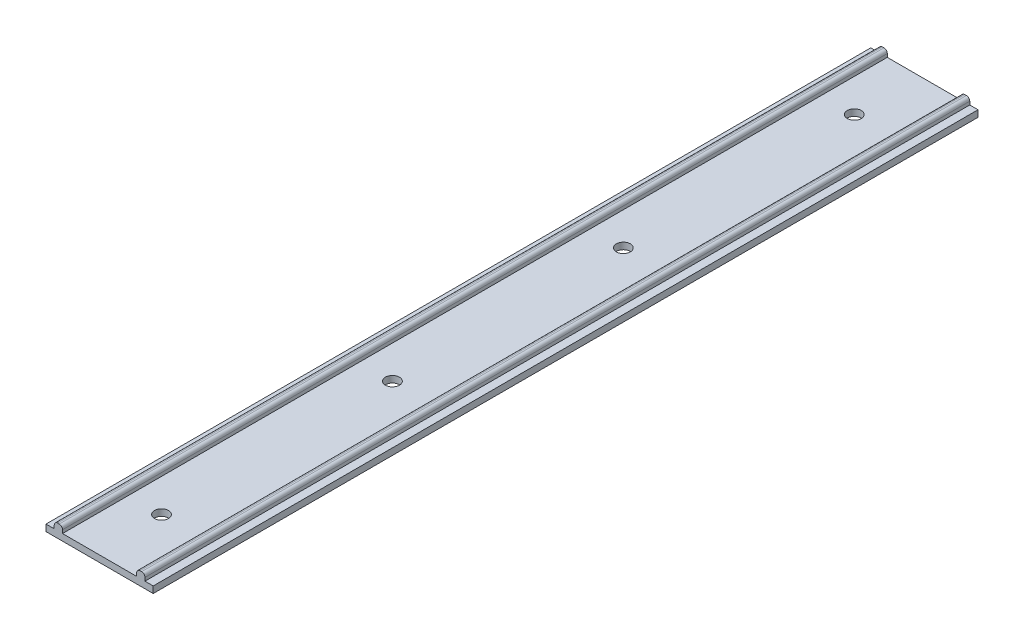
ISO-10303-21;
HEADER;
FILE_DESCRIPTION(('STEP AP214'),'2;1');
FILE_NAME('part.step','',(''),(''),'','','');
FILE_SCHEMA(('AUTOMOTIVE_DESIGN { 1 0 10303 214 1 1 1 1 }'));
ENDSEC;
DATA;
#1=APPLICATION_CONTEXT('core data for automotive mechanical design processes');
#2=APPLICATION_PROTOCOL_DEFINITION('international standard','automotive_design',2000,#1);
#3=PRODUCT_CONTEXT('',#1,'mechanical');
#4=PRODUCT('Part','Part','',(#3));
#5=PRODUCT_RELATED_PRODUCT_CATEGORY('part','',(#4));
#6=PRODUCT_DEFINITION_FORMATION('','',#4);
#7=PRODUCT_DEFINITION_CONTEXT('part definition',#1,'design');
#8=PRODUCT_DEFINITION('design','',#6,#7);
#9=PRODUCT_DEFINITION_SHAPE('','',#8);
#10=(LENGTH_UNIT() NAMED_UNIT(*) SI_UNIT(.MILLI.,.METRE.));
#11=(NAMED_UNIT(*) PLANE_ANGLE_UNIT() SI_UNIT($,.RADIAN.));
#12=(NAMED_UNIT(*) SI_UNIT($,.STERADIAN.) SOLID_ANGLE_UNIT());
#13=UNCERTAINTY_MEASURE_WITH_UNIT(LENGTH_MEASURE(1.E-05),#10,'distance_accuracy_value','');
#14=(GEOMETRIC_REPRESENTATION_CONTEXT(3) GLOBAL_UNCERTAINTY_ASSIGNED_CONTEXT((#13)) GLOBAL_UNIT_ASSIGNED_CONTEXT((#10,
#11,#12)) REPRESENTATION_CONTEXT('',''));
#15=CARTESIAN_POINT('',(0.,0.,0.));
#16=DIRECTION('',(0.,0.,1.));
#17=DIRECTION('',(1.,0.,0.));
#18=AXIS2_PLACEMENT_3D('',#15,#16,#17);
#19=CARTESIAN_POINT('',(0.,0.,-500.));
#20=DIRECTION('',(-1.,0.,0.));
#21=DIRECTION('',(0.,0.,1.));
#22=AXIS2_PLACEMENT_3D('',#19,#20,#21);
#23=PLANE('',#22);
#24=DIRECTION('',(0.,-1.,0.));
#25=VECTOR('',#24,1.);
#26=CARTESIAN_POINT('',(0.,0.,0.));
#27=LINE('',#26,#25);
#28=CARTESIAN_POINT('',(0.,4.,0.));
#29=VERTEX_POINT('',#28);
#30=CARTESIAN_POINT('',(0.,0.,0.));
#31=VERTEX_POINT('',#30);
#32=EDGE_CURVE('E208',#29,#31,#27,.T.);
#33=ORIENTED_EDGE('',*,*,#32,.F.);
#34=DIRECTION('',(0.,0.,1.));
#35=VECTOR('',#34,1.);
#36=CARTESIAN_POINT('',(0.,4.,-500.));
#37=LINE('',#36,#35);
#38=CARTESIAN_POINT('',(0.,4.,-500.));
#39=VERTEX_POINT('',#38);
#40=EDGE_CURVE('E175',#39,#29,#37,.T.);
#41=ORIENTED_EDGE('',*,*,#40,.F.);
#42=DIRECTION('',(0.,-1.,0.));
#43=VECTOR('',#42,1.);
#44=CARTESIAN_POINT('',(0.,0.,-500.));
#45=LINE('',#44,#43);
#46=CARTESIAN_POINT('',(0.,0.,-500.));
#47=VERTEX_POINT('',#46);
#48=EDGE_CURVE('E169',#39,#47,#45,.T.);
#49=ORIENTED_EDGE('',*,*,#48,.T.);
#50=DIRECTION('',(0.,0.,1.));
#51=VECTOR('',#50,1.);
#52=CARTESIAN_POINT('',(0.,0.,-500.));
#53=LINE('',#52,#51);
#54=EDGE_CURVE('E151',#47,#31,#53,.T.);
#55=ORIENTED_EDGE('',*,*,#54,.T.);
#56=EDGE_LOOP('',(#33,#41,#49,#55));
#57=FACE_BOUND('',#56,.T.);
#58=ADVANCED_FACE('F36',(#57),#23,.T.);
#59=CARTESIAN_POINT('',(0.,4.,-500.));
#60=DIRECTION('',(0.,1.,0.));
#61=DIRECTION('',(0.,0.,1.));
#62=AXIS2_PLACEMENT_3D('',#59,#60,#61);
#63=PLANE('',#62);
#64=DIRECTION('',(-1.,0.,0.));
#65=VECTOR('',#64,1.);
#66=CARTESIAN_POINT('',(0.,4.,0.));
#67=LINE('',#66,#65);
#68=CARTESIAN_POINT('',(5.,4.,0.));
#69=VERTEX_POINT('',#68);
#70=EDGE_CURVE('E176',#69,#29,#67,.T.);
#71=ORIENTED_EDGE('',*,*,#70,.F.);
#72=DIRECTION('',(0.,0.,1.));
#73=VECTOR('',#72,1.);
#74=CARTESIAN_POINT('',(5.,4.,-500.));
#75=LINE('',#74,#73);
#76=CARTESIAN_POINT('',(5.,4.,-500.));
#77=VERTEX_POINT('',#76);
#78=EDGE_CURVE('E237',#77,#69,#75,.T.);
#79=ORIENTED_EDGE('',*,*,#78,.F.);
#80=DIRECTION('',(-1.,0.,0.));
#81=VECTOR('',#80,1.);
#82=CARTESIAN_POINT('',(0.,4.,-500.));
#83=LINE('',#82,#81);
#84=EDGE_CURVE('E162',#77,#39,#83,.T.);
#85=ORIENTED_EDGE('',*,*,#84,.T.);
#86=ORIENTED_EDGE('',*,*,#40,.T.);
#87=EDGE_LOOP('',(#71,#79,#85,#86));
#88=FACE_BOUND('',#87,.T.);
#89=ADVANCED_FACE('F324',(#88),#63,.T.);
#90=CARTESIAN_POINT('',(5.,4.,-500.));
#91=DIRECTION('',(-1.,0.,0.));
#92=DIRECTION('',(0.,0.,1.));
#93=AXIS2_PLACEMENT_3D('',#90,#91,#92);
#94=PLANE('',#93);
#95=DIRECTION('',(0.,-1.,0.));
#96=VECTOR('',#95,1.);
#97=CARTESIAN_POINT('',(5.,4.,0.));
#98=LINE('',#97,#96);
#99=CARTESIAN_POINT('',(5.,6.,0.));
#100=VERTEX_POINT('',#99);
#101=EDGE_CURVE('E179',#100,#69,#98,.T.);
#102=ORIENTED_EDGE('',*,*,#101,.F.);
#103=DIRECTION('',(0.,0.,1.));
#104=VECTOR('',#103,1.);
#105=CARTESIAN_POINT('',(5.,6.,-500.));
#106=LINE('',#105,#104);
#107=CARTESIAN_POINT('',(5.,6.,-500.));
#108=VERTEX_POINT('',#107);
#109=EDGE_CURVE('E11',#100,#108,#106,.F.);
#110=ORIENTED_EDGE('',*,*,#109,.T.);
#111=DIRECTION('',(0.,-1.,0.));
#112=VECTOR('',#111,1.);
#113=CARTESIAN_POINT('',(5.,4.,-500.));
#114=LINE('',#113,#112);
#115=EDGE_CURVE('E205',#108,#77,#114,.T.);
#116=ORIENTED_EDGE('',*,*,#115,.T.);
#117=ORIENTED_EDGE('',*,*,#78,.T.);
#118=EDGE_LOOP('',(#102,#110,#116,#117));
#119=FACE_BOUND('',#118,.T.);
#120=ADVANCED_FACE('F328',(#119),#94,.T.);
#121=CARTESIAN_POINT('',(5.,8.,-500.));
#122=DIRECTION('',(0.,1.,0.));
#123=DIRECTION('',(-1.,0.,0.));
#124=AXIS2_PLACEMENT_3D('',#121,#122,#123);
#125=PLANE('',#124);
#126=DIRECTION('',(-1.,0.,0.));
#127=VECTOR('',#126,1.);
#128=CARTESIAN_POINT('',(5.,8.,0.));
#129=LINE('',#128,#127);
#130=CARTESIAN_POINT('',(8.00000000000001,8.,0.));
#131=VERTEX_POINT('',#130);
#132=CARTESIAN_POINT('',(7.,8.,0.));
#133=VERTEX_POINT('',#132);
#134=EDGE_CURVE('E231',#131,#133,#129,.T.);
#135=ORIENTED_EDGE('',*,*,#134,.F.);
#136=DIRECTION('',(0.,0.,1.));
#137=VECTOR('',#136,1.);
#138=CARTESIAN_POINT('',(8.00000000000001,8.,-500.));
#139=LINE('',#138,#137);
#140=CARTESIAN_POINT('',(8.00000000000001,8.,-500.));
#141=VERTEX_POINT('',#140);
#142=EDGE_CURVE('E44',#131,#141,#139,.F.);
#143=ORIENTED_EDGE('',*,*,#142,.T.);
#144=DIRECTION('',(-1.,0.,0.));
#145=VECTOR('',#144,1.);
#146=CARTESIAN_POINT('',(5.,8.,-500.));
#147=LINE('',#146,#145);
#148=CARTESIAN_POINT('',(7.,8.,-500.));
#149=VERTEX_POINT('',#148);
#150=EDGE_CURVE('E202',#141,#149,#147,.T.);
#151=ORIENTED_EDGE('',*,*,#150,.T.);
#152=DIRECTION('',(0.,0.,1.));
#153=VECTOR('',#152,1.);
#154=CARTESIAN_POINT('',(7.,8.,-500.));
#155=LINE('',#154,#153);
#156=EDGE_CURVE('E276',#149,#133,#155,.T.);
#157=ORIENTED_EDGE('',*,*,#156,.T.);
#158=EDGE_LOOP('',(#135,#143,#151,#157));
#159=FACE_BOUND('',#158,.T.);
#160=ADVANCED_FACE('F281',(#159),#125,.T.);
#161=CARTESIAN_POINT('',(10.,8.,-500.));
#162=DIRECTION('',(1.,0.,0.));
#163=DIRECTION('',(0.,1.,0.));
#164=AXIS2_PLACEMENT_3D('',#161,#162,#163);
#165=PLANE('',#164);
#166=DIRECTION('',(0.,1.,0.));
#167=VECTOR('',#166,1.);
#168=CARTESIAN_POINT('',(10.,8.,-500.));
#169=LINE('',#168,#167);
#170=CARTESIAN_POINT('',(10.,4.,-500.));
#171=VERTEX_POINT('',#170);
#172=CARTESIAN_POINT('',(10.,6.,-500.));
#173=VERTEX_POINT('',#172);
#174=EDGE_CURVE('E200',#171,#173,#169,.T.);
#175=ORIENTED_EDGE('',*,*,#174,.T.);
#176=DIRECTION('',(0.,0.,1.));
#177=VECTOR('',#176,1.);
#178=CARTESIAN_POINT('',(10.,6.,-500.));
#179=LINE('',#178,#177);
#180=CARTESIAN_POINT('',(10.,6.,0.));
#181=VERTEX_POINT('',#180);
#182=EDGE_CURVE('E273',#173,#181,#179,.T.);
#183=ORIENTED_EDGE('',*,*,#182,.T.);
#184=DIRECTION('',(0.,1.,0.));
#185=VECTOR('',#184,1.);
#186=CARTESIAN_POINT('',(10.,8.,0.));
#187=LINE('',#186,#185);
#188=CARTESIAN_POINT('',(10.,4.,0.));
#189=VERTEX_POINT('',#188);
#190=EDGE_CURVE('E228',#189,#181,#187,.T.);
#191=ORIENTED_EDGE('',*,*,#190,.F.);
#192=DIRECTION('',(0.,0.,1.));
#193=VECTOR('',#192,1.);
#194=CARTESIAN_POINT('',(10.,4.,-500.));
#195=LINE('',#194,#193);
#196=EDGE_CURVE('E240',#171,#189,#195,.T.);
#197=ORIENTED_EDGE('',*,*,#196,.F.);
#198=EDGE_LOOP('',(#175,#183,#191,#197));
#199=FACE_BOUND('',#198,.T.);
#200=ADVANCED_FACE('F290',(#199),#165,.T.);
#201=CARTESIAN_POINT('',(10.,4.,-500.));
#202=DIRECTION('',(0.,1.,0.));
#203=DIRECTION('',(0.,0.,1.));
#204=AXIS2_PLACEMENT_3D('',#201,#202,#203);
#205=PLANE('',#204);
#206=CARTESIAN_POINT('',(30.,4.,-40.));
#207=DIRECTION('',(0.,1.,0.));
#208=DIRECTION('',(0.,0.,1.));
#209=AXIS2_PLACEMENT_3D('',#206,#207,#208);
#210=CIRCLE('',#209,4.25000000000001);
#211=CARTESIAN_POINT('',(30.,4.,-35.75));
#212=VERTEX_POINT('',#211);
#213=EDGE_CURVE('E182',#212,#212,#210,.T.);
#214=ORIENTED_EDGE('',*,*,#213,.F.);
#215=EDGE_LOOP('',(#214));
#216=FACE_BOUND('',#215,.T.);
#217=CARTESIAN_POINT('',(30.,4.,-180.));
#218=DIRECTION('',(0.,1.,0.));
#219=DIRECTION('',(0.,0.,1.));
#220=AXIS2_PLACEMENT_3D('',#217,#218,#219);
#221=CIRCLE('',#220,4.25000000000001);
#222=CARTESIAN_POINT('',(30.,4.,-175.75));
#223=VERTEX_POINT('',#222);
#224=EDGE_CURVE('E469',#223,#223,#221,.T.);
#225=ORIENTED_EDGE('',*,*,#224,.F.);
#226=EDGE_LOOP('',(#225));
#227=FACE_BOUND('',#226,.T.);
#228=CARTESIAN_POINT('',(30.,4.,-320.));
#229=DIRECTION('',(0.,1.,0.));
#230=DIRECTION('',(0.,0.,1.));
#231=AXIS2_PLACEMENT_3D('',#228,#229,#230);
#232=CIRCLE('',#231,4.25000000000001);
#233=CARTESIAN_POINT('',(30.,4.,-315.75));
#234=VERTEX_POINT('',#233);
#235=EDGE_CURVE('E457',#234,#234,#232,.T.);
#236=ORIENTED_EDGE('',*,*,#235,.F.);
#237=EDGE_LOOP('',(#236));
#238=FACE_BOUND('',#237,.T.);
#239=CARTESIAN_POINT('',(30.,4.,-460.));
#240=DIRECTION('',(0.,1.,0.));
#241=DIRECTION('',(0.,0.,1.));
#242=AXIS2_PLACEMENT_3D('',#239,#240,#241);
#243=CIRCLE('',#242,4.25000000000001);
#244=CARTESIAN_POINT('',(30.,4.,-455.75));
#245=VERTEX_POINT('',#244);
#246=EDGE_CURVE('E454',#245,#245,#243,.T.);
#247=ORIENTED_EDGE('',*,*,#246,.F.);
#248=EDGE_LOOP('',(#247));
#249=FACE_BOUND('',#248,.T.);
#250=DIRECTION('',(-1.,0.,0.));
#251=VECTOR('',#250,1.);
#252=CARTESIAN_POINT('',(10.,4.,0.));
#253=LINE('',#252,#251);
#254=CARTESIAN_POINT('',(55.,4.,0.));
#255=VERTEX_POINT('',#254);
#256=EDGE_CURVE('E225',#255,#189,#253,.T.);
#257=ORIENTED_EDGE('',*,*,#256,.F.);
#258=DIRECTION('',(0.,0.,1.));
#259=VECTOR('',#258,1.);
#260=CARTESIAN_POINT('',(55.,4.,-500.));
#261=LINE('',#260,#259);
#262=CARTESIAN_POINT('',(55.,4.,-500.));
#263=VERTEX_POINT('',#262);
#264=EDGE_CURVE('E242',#263,#255,#261,.T.);
#265=ORIENTED_EDGE('',*,*,#264,.F.);
#266=DIRECTION('',(-1.,0.,0.));
#267=VECTOR('',#266,1.);
#268=CARTESIAN_POINT('',(10.,4.,-500.));
#269=LINE('',#268,#267);
#270=EDGE_CURVE('E197',#263,#171,#269,.T.);
#271=ORIENTED_EDGE('',*,*,#270,.T.);
#272=ORIENTED_EDGE('',*,*,#196,.T.);
#273=EDGE_LOOP('',(#257,#265,#271,#272));
#274=FACE_BOUND('',#273,.T.);
#275=ADVANCED_FACE('F296',(#216,#227,#238,#249,#274),#205,.T.);
#276=CARTESIAN_POINT('',(55.,4.,-500.));
#277=DIRECTION('',(-1.,0.,0.));
#278=DIRECTION('',(0.,0.,1.));
#279=AXIS2_PLACEMENT_3D('',#276,#277,#278);
#280=PLANE('',#279);
#281=DIRECTION('',(0.,-1.,0.));
#282=VECTOR('',#281,1.);
#283=CARTESIAN_POINT('',(55.,4.,0.));
#284=LINE('',#283,#282);
#285=CARTESIAN_POINT('',(55.,6.,0.));
#286=VERTEX_POINT('',#285);
#287=EDGE_CURVE('E223',#286,#255,#284,.T.);
#288=ORIENTED_EDGE('',*,*,#287,.F.);
#289=DIRECTION('',(0.,0.,1.));
#290=VECTOR('',#289,1.);
#291=CARTESIAN_POINT('',(55.,6.,-500.));
#292=LINE('',#291,#290);
#293=CARTESIAN_POINT('',(55.,6.,-500.));
#294=VERTEX_POINT('',#293);
#295=EDGE_CURVE('E51',#286,#294,#292,.F.);
#296=ORIENTED_EDGE('',*,*,#295,.T.);
#297=DIRECTION('',(0.,-1.,0.));
#298=VECTOR('',#297,1.);
#299=CARTESIAN_POINT('',(55.,4.,-500.));
#300=LINE('',#299,#298);
#301=EDGE_CURVE('E195',#294,#263,#300,.T.);
#302=ORIENTED_EDGE('',*,*,#301,.T.);
#303=ORIENTED_EDGE('',*,*,#264,.T.);
#304=EDGE_LOOP('',(#288,#296,#302,#303));
#305=FACE_BOUND('',#304,.T.);
#306=ADVANCED_FACE('F402',(#305),#280,.T.);
#307=CARTESIAN_POINT('',(55.,8.,-500.));
#308=DIRECTION('',(0.,1.,0.));
#309=DIRECTION('',(0.,0.,1.));
#310=AXIS2_PLACEMENT_3D('',#307,#308,#309);
#311=PLANE('',#310);
#312=DIRECTION('',(-1.,0.,0.));
#313=VECTOR('',#312,1.);
#314=CARTESIAN_POINT('',(55.,8.,0.));
#315=LINE('',#314,#313);
#316=CARTESIAN_POINT('',(58.,8.,0.));
#317=VERTEX_POINT('',#316);
#318=CARTESIAN_POINT('',(57.,8.,0.));
#319=VERTEX_POINT('',#318);
#320=EDGE_CURVE('E220',#317,#319,#315,.T.);
#321=ORIENTED_EDGE('',*,*,#320,.F.);
#322=DIRECTION('',(0.,0.,1.));
#323=VECTOR('',#322,1.);
#324=CARTESIAN_POINT('',(58.,8.,-500.));
#325=LINE('',#324,#323);
#326=CARTESIAN_POINT('',(58.,8.,-500.));
#327=VERTEX_POINT('',#326);
#328=EDGE_CURVE('E263',#317,#327,#325,.F.);
#329=ORIENTED_EDGE('',*,*,#328,.T.);
#330=DIRECTION('',(-1.,0.,0.));
#331=VECTOR('',#330,1.);
#332=CARTESIAN_POINT('',(55.,8.,-500.));
#333=LINE('',#332,#331);
#334=CARTESIAN_POINT('',(57.,8.,-500.));
#335=VERTEX_POINT('',#334);
#336=EDGE_CURVE('E192',#327,#335,#333,.T.);
#337=ORIENTED_EDGE('',*,*,#336,.T.);
#338=DIRECTION('',(0.,0.,1.));
#339=VECTOR('',#338,1.);
#340=CARTESIAN_POINT('',(57.,8.,-500.));
#341=LINE('',#340,#339);
#342=EDGE_CURVE('E260',#335,#319,#341,.T.);
#343=ORIENTED_EDGE('',*,*,#342,.T.);
#344=EDGE_LOOP('',(#321,#329,#337,#343));
#345=FACE_BOUND('',#344,.T.);
#346=ADVANCED_FACE('F304',(#345),#311,.T.);
#347=CARTESIAN_POINT('',(60.,8.,-500.));
#348=DIRECTION('',(1.,0.,0.));
#349=DIRECTION('',(0.,0.,-1.));
#350=AXIS2_PLACEMENT_3D('',#347,#348,#349);
#351=PLANE('',#350);
#352=DIRECTION('',(0.,1.,0.));
#353=VECTOR('',#352,1.);
#354=CARTESIAN_POINT('',(60.,8.,-500.));
#355=LINE('',#354,#353);
#356=CARTESIAN_POINT('',(60.,4.,-500.));
#357=VERTEX_POINT('',#356);
#358=CARTESIAN_POINT('',(60.,6.,-500.));
#359=VERTEX_POINT('',#358);
#360=EDGE_CURVE('E189',#357,#359,#355,.T.);
#361=ORIENTED_EDGE('',*,*,#360,.T.);
#362=DIRECTION('',(0.,0.,1.));
#363=VECTOR('',#362,1.);
#364=CARTESIAN_POINT('',(60.,6.,-500.));
#365=LINE('',#364,#363);
#366=CARTESIAN_POINT('',(60.,6.,0.));
#367=VERTEX_POINT('',#366);
#368=EDGE_CURVE('E236',#359,#367,#365,.T.);
#369=ORIENTED_EDGE('',*,*,#368,.T.);
#370=DIRECTION('',(0.,1.,0.));
#371=VECTOR('',#370,1.);
#372=CARTESIAN_POINT('',(60.,8.,0.));
#373=LINE('',#372,#371);
#374=CARTESIAN_POINT('',(60.,4.,0.));
#375=VERTEX_POINT('',#374);
#376=EDGE_CURVE('E217',#375,#367,#373,.T.);
#377=ORIENTED_EDGE('',*,*,#376,.F.);
#378=DIRECTION('',(0.,0.,1.));
#379=VECTOR('',#378,1.);
#380=CARTESIAN_POINT('',(60.,4.,-500.));
#381=LINE('',#380,#379);
#382=EDGE_CURVE('E245',#357,#375,#381,.T.);
#383=ORIENTED_EDGE('',*,*,#382,.F.);
#384=EDGE_LOOP('',(#361,#369,#377,#383));
#385=FACE_BOUND('',#384,.T.);
#386=ADVANCED_FACE('F312',(#385),#351,.T.);
#387=CARTESIAN_POINT('',(60.,4.,-500.));
#388=DIRECTION('',(0.,1.,0.));
#389=DIRECTION('',(0.,0.,1.));
#390=AXIS2_PLACEMENT_3D('',#387,#388,#389);
#391=PLANE('',#390);
#392=DIRECTION('',(-1.,0.,0.));
#393=VECTOR('',#392,1.);
#394=CARTESIAN_POINT('',(60.,4.,0.));
#395=LINE('',#394,#393);
#396=CARTESIAN_POINT('',(65.,4.,0.));
#397=VERTEX_POINT('',#396);
#398=EDGE_CURVE('E214',#397,#375,#395,.T.);
#399=ORIENTED_EDGE('',*,*,#398,.F.);
#400=DIRECTION('',(0.,0.,1.));
#401=VECTOR('',#400,1.);
#402=CARTESIAN_POINT('',(65.,4.,-500.));
#403=LINE('',#402,#401);
#404=CARTESIAN_POINT('',(65.,4.,-500.));
#405=VERTEX_POINT('',#404);
#406=EDGE_CURVE('E247',#405,#397,#403,.T.);
#407=ORIENTED_EDGE('',*,*,#406,.F.);
#408=DIRECTION('',(-1.,0.,0.));
#409=VECTOR('',#408,1.);
#410=CARTESIAN_POINT('',(60.,4.,-500.));
#411=LINE('',#410,#409);
#412=EDGE_CURVE('E186',#405,#357,#411,.T.);
#413=ORIENTED_EDGE('',*,*,#412,.T.);
#414=ORIENTED_EDGE('',*,*,#382,.T.);
#415=EDGE_LOOP('',(#399,#407,#413,#414));
#416=FACE_BOUND('',#415,.T.);
#417=ADVANCED_FACE('F316',(#416),#391,.T.);
#418=CARTESIAN_POINT('',(65.,4.,-500.));
#419=DIRECTION('',(1.,0.,0.));
#420=DIRECTION('',(0.,0.,-1.));
#421=AXIS2_PLACEMENT_3D('',#418,#419,#420);
#422=PLANE('',#421);
#423=DIRECTION('',(0.,1.,0.));
#424=VECTOR('',#423,1.);
#425=CARTESIAN_POINT('',(65.,4.,0.));
#426=LINE('',#425,#424);
#427=CARTESIAN_POINT('',(65.,0.,0.));
#428=VERTEX_POINT('',#427);
#429=EDGE_CURVE('E211',#428,#397,#426,.T.);
#430=ORIENTED_EDGE('',*,*,#429,.F.);
#431=DIRECTION('',(0.,0.,1.));
#432=VECTOR('',#431,1.);
#433=CARTESIAN_POINT('',(65.,0.,-500.));
#434=LINE('',#433,#432);
#435=CARTESIAN_POINT('',(65.,0.,-500.));
#436=VERTEX_POINT('',#435);
#437=EDGE_CURVE('E161',#436,#428,#434,.T.);
#438=ORIENTED_EDGE('',*,*,#437,.F.);
#439=DIRECTION('',(0.,1.,0.));
#440=VECTOR('',#439,1.);
#441=CARTESIAN_POINT('',(65.,4.,-500.));
#442=LINE('',#441,#440);
#443=EDGE_CURVE('E173',#436,#405,#442,.T.);
#444=ORIENTED_EDGE('',*,*,#443,.T.);
#445=ORIENTED_EDGE('',*,*,#406,.T.);
#446=EDGE_LOOP('',(#430,#438,#444,#445));
#447=FACE_BOUND('',#446,.T.);
#448=ADVANCED_FACE('F319',(#447),#422,.T.);
#449=CARTESIAN_POINT('',(0.,0.,-500.));
#450=DIRECTION('',(0.,-1.,0.));
#451=DIRECTION('',(0.,0.,-1.));
#452=AXIS2_PLACEMENT_3D('',#449,#450,#451);
#453=PLANE('',#452);
#454=CARTESIAN_POINT('',(30.,0.,-40.));
#455=DIRECTION('',(0.,-1.,0.));
#456=DIRECTION('',(0.,0.,-1.));
#457=AXIS2_PLACEMENT_3D('',#454,#455,#456);
#458=CIRCLE('',#457,4.25000000000001);
#459=CARTESIAN_POINT('',(30.,0.,-44.25));
#460=VERTEX_POINT('',#459);
#461=EDGE_CURVE('E453',#460,#460,#458,.T.);
#462=ORIENTED_EDGE('',*,*,#461,.F.);
#463=EDGE_LOOP('',(#462));
#464=FACE_BOUND('',#463,.T.);
#465=CARTESIAN_POINT('',(30.,0.,-180.));
#466=DIRECTION('',(0.,-1.,0.));
#467=DIRECTION('',(0.,0.,-1.));
#468=AXIS2_PLACEMENT_3D('',#465,#466,#467);
#469=CIRCLE('',#468,4.25000000000001);
#470=CARTESIAN_POINT('',(30.,0.,-184.25));
#471=VERTEX_POINT('',#470);
#472=EDGE_CURVE('E455',#471,#471,#469,.T.);
#473=ORIENTED_EDGE('',*,*,#472,.F.);
#474=EDGE_LOOP('',(#473));
#475=FACE_BOUND('',#474,.T.);
#476=CARTESIAN_POINT('',(30.,0.,-320.));
#477=DIRECTION('',(0.,-1.,0.));
#478=DIRECTION('',(0.,0.,-1.));
#479=AXIS2_PLACEMENT_3D('',#476,#477,#478);
#480=CIRCLE('',#479,4.25000000000001);
#481=CARTESIAN_POINT('',(30.,0.,-324.25));
#482=VERTEX_POINT('',#481);
#483=EDGE_CURVE('E460',#482,#482,#480,.T.);
#484=ORIENTED_EDGE('',*,*,#483,.F.);
#485=EDGE_LOOP('',(#484));
#486=FACE_BOUND('',#485,.T.);
#487=CARTESIAN_POINT('',(30.,0.,-460.));
#488=DIRECTION('',(0.,-1.,0.));
#489=DIRECTION('',(0.,0.,-1.));
#490=AXIS2_PLACEMENT_3D('',#487,#488,#489);
#491=CIRCLE('',#490,4.25000000000001);
#492=CARTESIAN_POINT('',(30.,0.,-464.25));
#493=VERTEX_POINT('',#492);
#494=EDGE_CURVE('E465',#493,#493,#491,.T.);
#495=ORIENTED_EDGE('',*,*,#494,.F.);
#496=EDGE_LOOP('',(#495));
#497=FACE_BOUND('',#496,.T.);
#498=DIRECTION('',(1.,0.,0.));
#499=VECTOR('',#498,1.);
#500=CARTESIAN_POINT('',(0.,0.,0.));
#501=LINE('',#500,#499);
#502=EDGE_CURVE('E156',#31,#428,#501,.T.);
#503=ORIENTED_EDGE('',*,*,#502,.F.);
#504=ORIENTED_EDGE('',*,*,#54,.F.);
#505=DIRECTION('',(1.,0.,0.));
#506=VECTOR('',#505,1.);
#507=CARTESIAN_POINT('',(0.,0.,-500.));
#508=LINE('',#507,#506);
#509=EDGE_CURVE('E154',#47,#436,#508,.T.);
#510=ORIENTED_EDGE('',*,*,#509,.T.);
#511=ORIENTED_EDGE('',*,*,#437,.T.);
#512=EDGE_LOOP('',(#503,#504,#510,#511));
#513=FACE_BOUND('',#512,.T.);
#514=ADVANCED_FACE('F153',(#464,#475,#486,#497,#513),#453,.T.);
#515=CARTESIAN_POINT('',(0.,0.,-500.));
#516=DIRECTION('',(0.,0.,-1.));
#517=DIRECTION('',(-1.,0.,0.));
#518=AXIS2_PLACEMENT_3D('',#515,#516,#517);
#519=PLANE('',#518);
#520=ORIENTED_EDGE('',*,*,#336,.F.);
#521=CARTESIAN_POINT('',(58.,6.,-500.));
#522=DIRECTION('',(0.,0.,-1.));
#523=DIRECTION('',(-1.,0.,0.));
#524=AXIS2_PLACEMENT_3D('',#521,#522,#523);
#525=CIRCLE('',#524,2.);
#526=EDGE_CURVE('E270',#327,#359,#525,.T.);
#527=ORIENTED_EDGE('',*,*,#526,.T.);
#528=ORIENTED_EDGE('',*,*,#360,.F.);
#529=ORIENTED_EDGE('',*,*,#412,.F.);
#530=ORIENTED_EDGE('',*,*,#443,.F.);
#531=ORIENTED_EDGE('',*,*,#509,.F.);
#532=ORIENTED_EDGE('',*,*,#48,.F.);
#533=ORIENTED_EDGE('',*,*,#84,.F.);
#534=ORIENTED_EDGE('',*,*,#115,.F.);
#535=CARTESIAN_POINT('',(7.,6.,-500.));
#536=DIRECTION('',(0.,0.,-1.));
#537=DIRECTION('',(-1.,0.,0.));
#538=AXIS2_PLACEMENT_3D('',#535,#536,#537);
#539=CIRCLE('',#538,2.);
#540=EDGE_CURVE('E265',#108,#149,#539,.T.);
#541=ORIENTED_EDGE('',*,*,#540,.T.);
#542=ORIENTED_EDGE('',*,*,#150,.F.);
#543=CARTESIAN_POINT('',(8.00000000000001,6.,-500.));
#544=DIRECTION('',(0.,0.,-1.));
#545=DIRECTION('',(-1.,0.,0.));
#546=AXIS2_PLACEMENT_3D('',#543,#544,#545);
#547=CIRCLE('',#546,2.);
#548=EDGE_CURVE('E59',#141,#173,#547,.T.);
#549=ORIENTED_EDGE('',*,*,#548,.T.);
#550=ORIENTED_EDGE('',*,*,#174,.F.);
#551=ORIENTED_EDGE('',*,*,#270,.F.);
#552=ORIENTED_EDGE('',*,*,#301,.F.);
#553=CARTESIAN_POINT('',(57.,6.,-500.));
#554=DIRECTION('',(0.,0.,-1.));
#555=DIRECTION('',(-1.,0.,0.));
#556=AXIS2_PLACEMENT_3D('',#553,#554,#555);
#557=CIRCLE('',#556,2.);
#558=EDGE_CURVE('E268',#294,#335,#557,.T.);
#559=ORIENTED_EDGE('',*,*,#558,.T.);
#560=EDGE_LOOP('',(#520,#527,#528,#529,#530,#531,#532,#533,#534,#541,#542,#549,#550,#551,#552,#559));
#561=FACE_BOUND('',#560,.T.);
#562=ADVANCED_FACE('F167',(#561),#519,.T.);
#563=CARTESIAN_POINT('',(0.,0.,0.));
#564=DIRECTION('',(0.,0.,-1.));
#565=DIRECTION('',(-1.,0.,0.));
#566=AXIS2_PLACEMENT_3D('',#563,#564,#565);
#567=PLANE('',#566);
#568=ORIENTED_EDGE('',*,*,#376,.T.);
#569=CARTESIAN_POINT('',(58.,6.,0.));
#570=DIRECTION('',(0.,0.,-1.));
#571=DIRECTION('',(-1.,0.,0.));
#572=AXIS2_PLACEMENT_3D('',#569,#570,#571);
#573=CIRCLE('',#572,2.);
#574=EDGE_CURVE('E258',#367,#317,#573,.F.);
#575=ORIENTED_EDGE('',*,*,#574,.T.);
#576=ORIENTED_EDGE('',*,*,#320,.T.);
#577=CARTESIAN_POINT('',(57.,6.,0.));
#578=DIRECTION('',(0.,0.,-1.));
#579=DIRECTION('',(-1.,0.,0.));
#580=AXIS2_PLACEMENT_3D('',#577,#578,#579);
#581=CIRCLE('',#580,2.);
#582=EDGE_CURVE('E256',#319,#286,#581,.F.);
#583=ORIENTED_EDGE('',*,*,#582,.T.);
#584=ORIENTED_EDGE('',*,*,#287,.T.);
#585=ORIENTED_EDGE('',*,*,#256,.T.);
#586=ORIENTED_EDGE('',*,*,#190,.T.);
#587=CARTESIAN_POINT('',(8.00000000000001,6.,0.));
#588=DIRECTION('',(0.,0.,-1.));
#589=DIRECTION('',(-1.,0.,0.));
#590=AXIS2_PLACEMENT_3D('',#587,#588,#589);
#591=CIRCLE('',#590,2.);
#592=EDGE_CURVE('E254',#181,#131,#591,.F.);
#593=ORIENTED_EDGE('',*,*,#592,.T.);
#594=ORIENTED_EDGE('',*,*,#134,.T.);
#595=CARTESIAN_POINT('',(7.,6.,0.));
#596=DIRECTION('',(0.,0.,-1.));
#597=DIRECTION('',(-1.,0.,0.));
#598=AXIS2_PLACEMENT_3D('',#595,#596,#597);
#599=CIRCLE('',#598,2.);
#600=EDGE_CURVE('E252',#133,#100,#599,.F.);
#601=ORIENTED_EDGE('',*,*,#600,.T.);
#602=ORIENTED_EDGE('',*,*,#101,.T.);
#603=ORIENTED_EDGE('',*,*,#70,.T.);
#604=ORIENTED_EDGE('',*,*,#32,.T.);
#605=ORIENTED_EDGE('',*,*,#502,.T.);
#606=ORIENTED_EDGE('',*,*,#429,.T.);
#607=ORIENTED_EDGE('',*,*,#398,.T.);
#608=EDGE_LOOP('',(#568,#575,#576,#583,#584,#585,#586,#593,#594,#601,#602,#603,#604,#605,#606,#607));
#609=FACE_BOUND('',#608,.T.);
#610=ADVANCED_FACE('F292',(#609),#567,.F.);
#611=CARTESIAN_POINT('',(58.,6.,-500.));
#612=DIRECTION('',(0.,0.,1.));
#613=DIRECTION('',(1.,0.,0.));
#614=AXIS2_PLACEMENT_3D('',#611,#612,#613);
#615=CYLINDRICAL_SURFACE('',#614,2.);
#616=ORIENTED_EDGE('',*,*,#526,.F.);
#617=ORIENTED_EDGE('',*,*,#328,.F.);
#618=ORIENTED_EDGE('',*,*,#574,.F.);
#619=ORIENTED_EDGE('',*,*,#368,.F.);
#620=EDGE_LOOP('',(#616,#617,#618,#619));
#621=FACE_BOUND('',#620,.T.);
#622=ADVANCED_FACE('F310',(#621),#615,.T.);
#623=CARTESIAN_POINT('',(57.,6.,-500.));
#624=DIRECTION('',(0.,0.,1.));
#625=DIRECTION('',(1.,0.,0.));
#626=AXIS2_PLACEMENT_3D('',#623,#624,#625);
#627=CYLINDRICAL_SURFACE('',#626,2.);
#628=ORIENTED_EDGE('',*,*,#558,.F.);
#629=ORIENTED_EDGE('',*,*,#295,.F.);
#630=ORIENTED_EDGE('',*,*,#582,.F.);
#631=ORIENTED_EDGE('',*,*,#342,.F.);
#632=EDGE_LOOP('',(#628,#629,#630,#631));
#633=FACE_BOUND('',#632,.T.);
#634=ADVANCED_FACE('F301',(#633),#627,.T.);
#635=CARTESIAN_POINT('',(8.00000000000001,6.,-500.));
#636=DIRECTION('',(0.,0.,1.));
#637=DIRECTION('',(1.,0.,0.));
#638=AXIS2_PLACEMENT_3D('',#635,#636,#637);
#639=CYLINDRICAL_SURFACE('',#638,2.);
#640=ORIENTED_EDGE('',*,*,#548,.F.);
#641=ORIENTED_EDGE('',*,*,#142,.F.);
#642=ORIENTED_EDGE('',*,*,#592,.F.);
#643=ORIENTED_EDGE('',*,*,#182,.F.);
#644=EDGE_LOOP('',(#640,#641,#642,#643));
#645=FACE_BOUND('',#644,.T.);
#646=ADVANCED_FACE('F287',(#645),#639,.T.);
#647=CARTESIAN_POINT('',(7.,6.,-500.));
#648=DIRECTION('',(0.,0.,1.));
#649=DIRECTION('',(1.,0.,0.));
#650=AXIS2_PLACEMENT_3D('',#647,#648,#649);
#651=CYLINDRICAL_SURFACE('',#650,2.);
#652=ORIENTED_EDGE('',*,*,#540,.F.);
#653=ORIENTED_EDGE('',*,*,#109,.F.);
#654=ORIENTED_EDGE('',*,*,#600,.F.);
#655=ORIENTED_EDGE('',*,*,#156,.F.);
#656=EDGE_LOOP('',(#652,#653,#654,#655));
#657=FACE_BOUND('',#656,.T.);
#658=ADVANCED_FACE('F38',(#657),#651,.T.);
#659=CARTESIAN_POINT('',(30.,10.,-460.));
#660=DIRECTION('',(0.,-1.,0.));
#661=DIRECTION('',(0.,0.,-1.));
#662=AXIS2_PLACEMENT_3D('',#659,#660,#661);
#663=CYLINDRICAL_SURFACE('',#662,4.25000000000001);
#664=ORIENTED_EDGE('',*,*,#246,.T.);
#665=EDGE_LOOP('',(#664));
#666=FACE_BOUND('',#665,.T.);
#667=ORIENTED_EDGE('',*,*,#494,.T.);
#668=EDGE_LOOP('',(#667));
#669=FACE_BOUND('',#668,.T.);
#670=ADVANCED_FACE('F351',(#666,#669),#663,.F.);
#671=CARTESIAN_POINT('',(30.,10.,-320.));
#672=DIRECTION('',(0.,-1.,0.));
#673=DIRECTION('',(0.,0.,-1.));
#674=AXIS2_PLACEMENT_3D('',#671,#672,#673);
#675=CYLINDRICAL_SURFACE('',#674,4.25000000000001);
#676=ORIENTED_EDGE('',*,*,#235,.T.);
#677=EDGE_LOOP('',(#676));
#678=FACE_BOUND('',#677,.T.);
#679=ORIENTED_EDGE('',*,*,#483,.T.);
#680=EDGE_LOOP('',(#679));
#681=FACE_BOUND('',#680,.T.);
#682=ADVANCED_FACE('F355',(#678,#681),#675,.F.);
#683=CARTESIAN_POINT('',(30.,10.,-180.));
#684=DIRECTION('',(0.,-1.,0.));
#685=DIRECTION('',(0.,0.,-1.));
#686=AXIS2_PLACEMENT_3D('',#683,#684,#685);
#687=CYLINDRICAL_SURFACE('',#686,4.25000000000001);
#688=ORIENTED_EDGE('',*,*,#224,.T.);
#689=EDGE_LOOP('',(#688));
#690=FACE_BOUND('',#689,.T.);
#691=ORIENTED_EDGE('',*,*,#472,.T.);
#692=EDGE_LOOP('',(#691));
#693=FACE_BOUND('',#692,.T.);
#694=ADVANCED_FACE('F361',(#690,#693),#687,.F.);
#695=CARTESIAN_POINT('',(30.,10.,-40.));
#696=DIRECTION('',(0.,-1.,0.));
#697=DIRECTION('',(0.,0.,-1.));
#698=AXIS2_PLACEMENT_3D('',#695,#696,#697);
#699=CYLINDRICAL_SURFACE('',#698,4.25000000000001);
#700=ORIENTED_EDGE('',*,*,#213,.T.);
#701=EDGE_LOOP('',(#700));
#702=FACE_BOUND('',#701,.T.);
#703=ORIENTED_EDGE('',*,*,#461,.T.);
#704=EDGE_LOOP('',(#703));
#705=FACE_BOUND('',#704,.T.);
#706=ADVANCED_FACE('F435',(#702,#705),#699,.F.);
#707=CLOSED_SHELL('',(#58,#89,#120,#160,#200,#275,#306,#346,#386,#417,#448,#514,#562,#610,#622,
#634,#646,#658,#670,#682,#694,#706));
#708=MANIFOLD_SOLID_BREP('B2',#707);
#709=ADVANCED_BREP_SHAPE_REPRESENTATION('',(#18,#708),#14);
#710=SHAPE_DEFINITION_REPRESENTATION(#9,#709);
ENDSEC;
END-ISO-10303-21;
